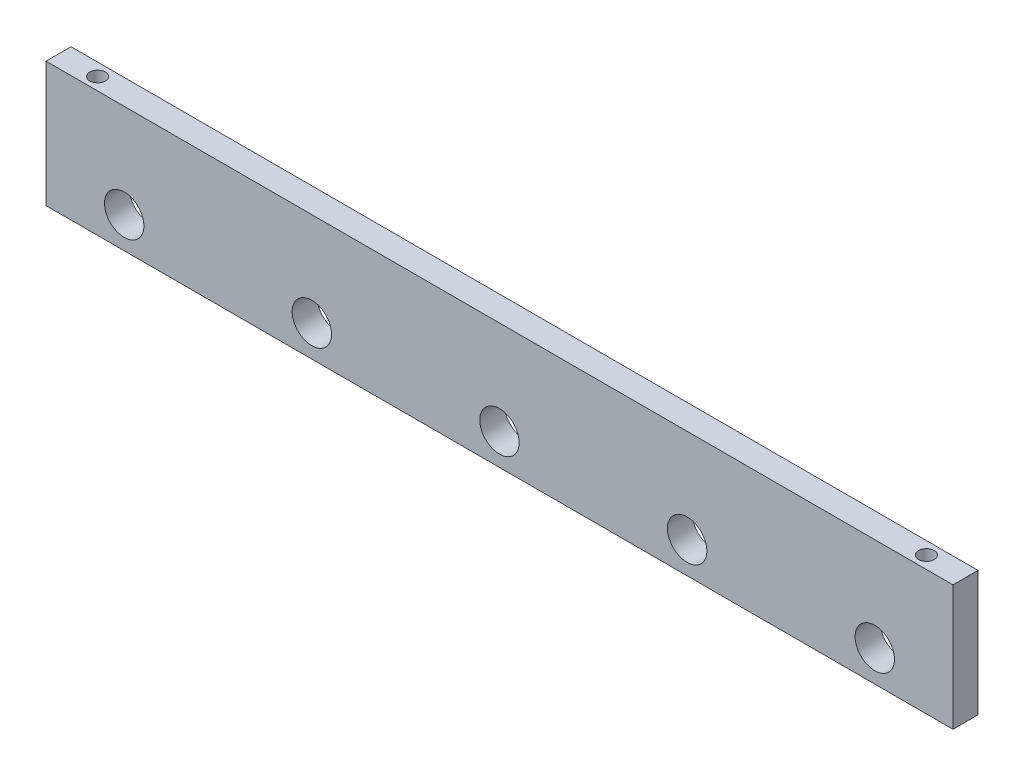
ISO-10303-21;
HEADER;
FILE_DESCRIPTION(('STEP AP214'),'2;1');
FILE_NAME('part.step','',(''),(''),'','','');
FILE_SCHEMA(('AUTOMOTIVE_DESIGN { 1 0 10303 214 1 1 1 1 }'));
ENDSEC;
DATA;
#1=APPLICATION_CONTEXT('core data for automotive mechanical design processes');
#2=APPLICATION_PROTOCOL_DEFINITION('international standard','automotive_design',2000,#1);
#3=PRODUCT_CONTEXT('',#1,'mechanical');
#4=PRODUCT('Part','Part','',(#3));
#5=PRODUCT_RELATED_PRODUCT_CATEGORY('part','',(#4));
#6=PRODUCT_DEFINITION_FORMATION('','',#4);
#7=PRODUCT_DEFINITION_CONTEXT('part definition',#1,'design');
#8=PRODUCT_DEFINITION('design','',#6,#7);
#9=PRODUCT_DEFINITION_SHAPE('','',#8);
#10=(LENGTH_UNIT() NAMED_UNIT(*) SI_UNIT(.MILLI.,.METRE.));
#11=(NAMED_UNIT(*) PLANE_ANGLE_UNIT() SI_UNIT($,.RADIAN.));
#12=(NAMED_UNIT(*) SI_UNIT($,.STERADIAN.) SOLID_ANGLE_UNIT());
#13=UNCERTAINTY_MEASURE_WITH_UNIT(LENGTH_MEASURE(1.E-05),#10,'distance_accuracy_value','');
#14=(GEOMETRIC_REPRESENTATION_CONTEXT(3) GLOBAL_UNCERTAINTY_ASSIGNED_CONTEXT((#13)) GLOBAL_UNIT_ASSIGNED_CONTEXT((#10,
#11,#12)) REPRESENTATION_CONTEXT('',''));
#15=CARTESIAN_POINT('',(0.,0.,0.));
#16=DIRECTION('',(0.,0.,1.));
#17=DIRECTION('',(1.,0.,0.));
#18=AXIS2_PLACEMENT_3D('',#15,#16,#17);
#19=CARTESIAN_POINT('',(0.,0.,8.));
#20=DIRECTION('',(0.,0.,-1.));
#21=DIRECTION('',(-1.,0.,0.));
#22=AXIS2_PLACEMENT_3D('',#19,#20,#21);
#23=PLANE('',#22);
#24=DIRECTION('',(0.,1.,0.));
#25=VECTOR('',#24,1.);
#26=CARTESIAN_POINT('',(290.,-40.,8.));
#27=LINE('',#26,#25);
#28=CARTESIAN_POINT('',(290.,-40.,8.));
#29=VERTEX_POINT('',#28);
#30=CARTESIAN_POINT('',(290.,40.,8.));
#31=VERTEX_POINT('',#30);
#32=EDGE_CURVE('E98',#29,#31,#27,.T.);
#33=ORIENTED_EDGE('',*,*,#32,.T.);
#34=DIRECTION('',(-1.,0.,0.));
#35=VECTOR('',#34,1.);
#36=CARTESIAN_POINT('',(-290.,40.,8.));
#37=LINE('',#36,#35);
#38=CARTESIAN_POINT('',(-290.,40.,8.));
#39=VERTEX_POINT('',#38);
#40=EDGE_CURVE('E93',#31,#39,#37,.T.);
#41=ORIENTED_EDGE('',*,*,#40,.T.);
#42=DIRECTION('',(0.,-1.,0.));
#43=VECTOR('',#42,1.);
#44=CARTESIAN_POINT('',(-290.,-40.,8.));
#45=LINE('',#44,#43);
#46=CARTESIAN_POINT('',(-290.,-40.,8.));
#47=VERTEX_POINT('',#46);
#48=EDGE_CURVE('E96',#39,#47,#45,.T.);
#49=ORIENTED_EDGE('',*,*,#48,.T.);
#50=DIRECTION('',(1.,0.,0.));
#51=VECTOR('',#50,1.);
#52=CARTESIAN_POINT('',(-290.,-40.,8.));
#53=LINE('',#52,#51);
#54=EDGE_CURVE('E63',#47,#29,#53,.T.);
#55=ORIENTED_EDGE('',*,*,#54,.T.);
#56=EDGE_LOOP('',(#33,#41,#49,#55));
#57=FACE_BOUND('',#56,.T.);
#58=CARTESIAN_POINT('',(-240.,-20.,8.));
#59=DIRECTION('',(0.,0.,1.));
#60=DIRECTION('',(1.,0.,0.));
#61=AXIS2_PLACEMENT_3D('',#58,#59,#60);
#62=CIRCLE('',#61,12.6);
#63=CARTESIAN_POINT('',(-227.4,-20.,8.));
#64=VERTEX_POINT('',#63);
#65=EDGE_CURVE('E118',#64,#64,#62,.T.);
#66=ORIENTED_EDGE('',*,*,#65,.F.);
#67=EDGE_LOOP('',(#66));
#68=FACE_BOUND('',#67,.T.);
#69=CARTESIAN_POINT('',(-120.,-20.,8.));
#70=DIRECTION('',(0.,0.,1.));
#71=DIRECTION('',(1.,0.,0.));
#72=AXIS2_PLACEMENT_3D('',#69,#70,#71);
#73=CIRCLE('',#72,12.6);
#74=CARTESIAN_POINT('',(-107.4,-20.,8.));
#75=VERTEX_POINT('',#74);
#76=EDGE_CURVE('E140',#75,#75,#73,.T.);
#77=ORIENTED_EDGE('',*,*,#76,.F.);
#78=EDGE_LOOP('',(#77));
#79=FACE_BOUND('',#78,.T.);
#80=CARTESIAN_POINT('',(0.,-20.,8.));
#81=DIRECTION('',(0.,0.,1.));
#82=DIRECTION('',(1.,0.,0.));
#83=AXIS2_PLACEMENT_3D('',#80,#81,#82);
#84=CIRCLE('',#83,12.6);
#85=CARTESIAN_POINT('',(12.6,-20.,8.));
#86=VERTEX_POINT('',#85);
#87=EDGE_CURVE('E148',#86,#86,#84,.T.);
#88=ORIENTED_EDGE('',*,*,#87,.F.);
#89=EDGE_LOOP('',(#88));
#90=FACE_BOUND('',#89,.T.);
#91=CARTESIAN_POINT('',(120.,-20.,8.));
#92=DIRECTION('',(0.,0.,1.));
#93=DIRECTION('',(1.,0.,0.));
#94=AXIS2_PLACEMENT_3D('',#91,#92,#93);
#95=CIRCLE('',#94,12.6);
#96=CARTESIAN_POINT('',(132.6,-20.,8.));
#97=VERTEX_POINT('',#96);
#98=EDGE_CURVE('E156',#97,#97,#95,.T.);
#99=ORIENTED_EDGE('',*,*,#98,.F.);
#100=EDGE_LOOP('',(#99));
#101=FACE_BOUND('',#100,.T.);
#102=CARTESIAN_POINT('',(240.,-20.,8.));
#103=DIRECTION('',(0.,0.,1.));
#104=DIRECTION('',(1.,0.,0.));
#105=AXIS2_PLACEMENT_3D('',#102,#103,#104);
#106=CIRCLE('',#105,12.6);
#107=CARTESIAN_POINT('',(252.6,-20.,8.));
#108=VERTEX_POINT('',#107);
#109=EDGE_CURVE('E164',#108,#108,#106,.T.);
#110=ORIENTED_EDGE('',*,*,#109,.F.);
#111=EDGE_LOOP('',(#110));
#112=FACE_BOUND('',#111,.T.);
#113=ADVANCED_FACE('F45',(#57,#68,#79,#90,#101,#112),#23,.F.);
#114=CARTESIAN_POINT('',(0.,0.,-8.));
#115=DIRECTION('',(0.,0.,-1.));
#116=DIRECTION('',(-1.,0.,0.));
#117=AXIS2_PLACEMENT_3D('',#114,#115,#116);
#118=PLANE('',#117);
#119=CARTESIAN_POINT('',(120.,-20.,-8.));
#120=DIRECTION('',(0.,0.,1.));
#121=DIRECTION('',(1.,0.,0.));
#122=AXIS2_PLACEMENT_3D('',#119,#120,#121);
#123=CIRCLE('',#122,12.6);
#124=CARTESIAN_POINT('',(132.6,-20.,-8.));
#125=VERTEX_POINT('',#124);
#126=EDGE_CURVE('E160',#125,#125,#123,.T.);
#127=ORIENTED_EDGE('',*,*,#126,.T.);
#128=EDGE_LOOP('',(#127));
#129=FACE_BOUND('',#128,.T.);
#130=CARTESIAN_POINT('',(-120.,-20.,-8.));
#131=DIRECTION('',(0.,0.,1.));
#132=DIRECTION('',(1.,0.,0.));
#133=AXIS2_PLACEMENT_3D('',#130,#131,#132);
#134=CIRCLE('',#133,12.6);
#135=CARTESIAN_POINT('',(-107.4,-20.,-8.));
#136=VERTEX_POINT('',#135);
#137=EDGE_CURVE('E144',#136,#136,#134,.T.);
#138=ORIENTED_EDGE('',*,*,#137,.T.);
#139=EDGE_LOOP('',(#138));
#140=FACE_BOUND('',#139,.T.);
#141=DIRECTION('',(0.,1.,0.));
#142=VECTOR('',#141,1.);
#143=CARTESIAN_POINT('',(290.,-40.,-8.));
#144=LINE('',#143,#142);
#145=CARTESIAN_POINT('',(290.,-40.,-8.));
#146=VERTEX_POINT('',#145);
#147=CARTESIAN_POINT('',(290.,40.,-8.));
#148=VERTEX_POINT('',#147);
#149=EDGE_CURVE('E114',#146,#148,#144,.T.);
#150=ORIENTED_EDGE('',*,*,#149,.F.);
#151=DIRECTION('',(1.,0.,0.));
#152=VECTOR('',#151,1.);
#153=CARTESIAN_POINT('',(-290.,-40.,-8.));
#154=LINE('',#153,#152);
#155=CARTESIAN_POINT('',(-290.,-40.,-8.));
#156=VERTEX_POINT('',#155);
#157=EDGE_CURVE('E86',#156,#146,#154,.T.);
#158=ORIENTED_EDGE('',*,*,#157,.F.);
#159=DIRECTION('',(0.,-1.,0.));
#160=VECTOR('',#159,1.);
#161=CARTESIAN_POINT('',(-290.,-40.,-8.));
#162=LINE('',#161,#160);
#163=CARTESIAN_POINT('',(-290.,40.,-8.));
#164=VERTEX_POINT('',#163);
#165=EDGE_CURVE('E80',#164,#156,#162,.T.);
#166=ORIENTED_EDGE('',*,*,#165,.F.);
#167=DIRECTION('',(-1.,0.,0.));
#168=VECTOR('',#167,1.);
#169=CARTESIAN_POINT('',(-290.,40.,-8.));
#170=LINE('',#169,#168);
#171=EDGE_CURVE('E103',#148,#164,#170,.T.);
#172=ORIENTED_EDGE('',*,*,#171,.F.);
#173=EDGE_LOOP('',(#150,#158,#166,#172));
#174=FACE_BOUND('',#173,.T.);
#175=CARTESIAN_POINT('',(-240.,-20.,-8.));
#176=DIRECTION('',(0.,0.,1.));
#177=DIRECTION('',(1.,0.,0.));
#178=AXIS2_PLACEMENT_3D('',#175,#176,#177);
#179=CIRCLE('',#178,12.6);
#180=CARTESIAN_POINT('',(-227.4,-20.,-8.));
#181=VERTEX_POINT('',#180);
#182=EDGE_CURVE('E136',#181,#181,#179,.T.);
#183=ORIENTED_EDGE('',*,*,#182,.T.);
#184=EDGE_LOOP('',(#183));
#185=FACE_BOUND('',#184,.T.);
#186=CARTESIAN_POINT('',(0.,-20.,-8.));
#187=DIRECTION('',(0.,0.,1.));
#188=DIRECTION('',(1.,0.,0.));
#189=AXIS2_PLACEMENT_3D('',#186,#187,#188);
#190=CIRCLE('',#189,12.6);
#191=CARTESIAN_POINT('',(12.6,-20.,-8.));
#192=VERTEX_POINT('',#191);
#193=EDGE_CURVE('E152',#192,#192,#190,.T.);
#194=ORIENTED_EDGE('',*,*,#193,.T.);
#195=EDGE_LOOP('',(#194));
#196=FACE_BOUND('',#195,.T.);
#197=CARTESIAN_POINT('',(240.,-20.,-8.));
#198=DIRECTION('',(0.,0.,1.));
#199=DIRECTION('',(1.,0.,0.));
#200=AXIS2_PLACEMENT_3D('',#197,#198,#199);
#201=CIRCLE('',#200,12.6);
#202=CARTESIAN_POINT('',(252.6,-20.,-8.));
#203=VERTEX_POINT('',#202);
#204=EDGE_CURVE('E168',#203,#203,#201,.T.);
#205=ORIENTED_EDGE('',*,*,#204,.T.);
#206=EDGE_LOOP('',(#205));
#207=FACE_BOUND('',#206,.T.);
#208=ADVANCED_FACE('F131',(#129,#140,#174,#185,#196,#207),#118,.T.);
#209=CARTESIAN_POINT('',(290.,-40.,8.));
#210=DIRECTION('',(-1.,0.,0.));
#211=DIRECTION('',(0.,0.,1.));
#212=AXIS2_PLACEMENT_3D('',#209,#210,#211);
#213=PLANE('',#212);
#214=ORIENTED_EDGE('',*,*,#149,.T.);
#215=DIRECTION('',(0.,0.,-1.));
#216=VECTOR('',#215,1.);
#217=CARTESIAN_POINT('',(290.,40.,8.));
#218=LINE('',#217,#216);
#219=EDGE_CURVE('E11',#31,#148,#218,.T.);
#220=ORIENTED_EDGE('',*,*,#219,.F.);
#221=ORIENTED_EDGE('',*,*,#32,.F.);
#222=DIRECTION('',(0.,0.,-1.));
#223=VECTOR('',#222,1.);
#224=CARTESIAN_POINT('',(290.,-40.,8.));
#225=LINE('',#224,#223);
#226=EDGE_CURVE('E110',#29,#146,#225,.T.);
#227=ORIENTED_EDGE('',*,*,#226,.T.);
#228=EDGE_LOOP('',(#214,#220,#221,#227));
#229=FACE_BOUND('',#228,.T.);
#230=ADVANCED_FACE('F47',(#229),#213,.F.);
#231=CARTESIAN_POINT('',(-290.,40.,8.));
#232=DIRECTION('',(0.,-1.,0.));
#233=DIRECTION('',(0.,0.,-1.));
#234=AXIS2_PLACEMENT_3D('',#231,#232,#233);
#235=PLANE('',#234);
#236=CARTESIAN_POINT('',(-265.,40.,0.));
#237=DIRECTION('',(0.,1.,0.));
#238=DIRECTION('',(0.,0.,1.));
#239=AXIS2_PLACEMENT_3D('',#236,#237,#238);
#240=CIRCLE('',#239,4.99999999999999);
#241=CARTESIAN_POINT('',(-265.,40.,4.99999999999999));
#242=VERTEX_POINT('',#241);
#243=EDGE_CURVE('E184',#242,#242,#240,.T.);
#244=ORIENTED_EDGE('',*,*,#243,.F.);
#245=EDGE_LOOP('',(#244));
#246=FACE_BOUND('',#245,.T.);
#247=CARTESIAN_POINT('',(265.,40.,0.));
#248=DIRECTION('',(0.,1.,0.));
#249=DIRECTION('',(0.,0.,1.));
#250=AXIS2_PLACEMENT_3D('',#247,#248,#249);
#251=CIRCLE('',#250,4.99999999999999);
#252=CARTESIAN_POINT('',(265.,40.,4.99999999999999));
#253=VERTEX_POINT('',#252);
#254=EDGE_CURVE('E180',#253,#253,#251,.T.);
#255=ORIENTED_EDGE('',*,*,#254,.F.);
#256=EDGE_LOOP('',(#255));
#257=FACE_BOUND('',#256,.T.);
#258=ORIENTED_EDGE('',*,*,#171,.T.);
#259=DIRECTION('',(0.,0.,-1.));
#260=VECTOR('',#259,1.);
#261=CARTESIAN_POINT('',(-290.,40.,8.));
#262=LINE('',#261,#260);
#263=EDGE_CURVE('E55',#39,#164,#262,.T.);
#264=ORIENTED_EDGE('',*,*,#263,.F.);
#265=ORIENTED_EDGE('',*,*,#40,.F.);
#266=ORIENTED_EDGE('',*,*,#219,.T.);
#267=EDGE_LOOP('',(#258,#264,#265,#266));
#268=FACE_BOUND('',#267,.T.);
#269=ADVANCED_FACE('F102',(#246,#257,#268),#235,.F.);
#270=CARTESIAN_POINT('',(-290.,-40.,8.));
#271=DIRECTION('',(1.,0.,0.));
#272=DIRECTION('',(0.,0.,-1.));
#273=AXIS2_PLACEMENT_3D('',#270,#271,#272);
#274=PLANE('',#273);
#275=ORIENTED_EDGE('',*,*,#165,.T.);
#276=DIRECTION('',(0.,0.,-1.));
#277=VECTOR('',#276,1.);
#278=CARTESIAN_POINT('',(-290.,-40.,8.));
#279=LINE('',#278,#277);
#280=EDGE_CURVE('E105',#47,#156,#279,.T.);
#281=ORIENTED_EDGE('',*,*,#280,.F.);
#282=ORIENTED_EDGE('',*,*,#48,.F.);
#283=ORIENTED_EDGE('',*,*,#263,.T.);
#284=EDGE_LOOP('',(#275,#281,#282,#283));
#285=FACE_BOUND('',#284,.T.);
#286=ADVANCED_FACE('F106',(#285),#274,.F.);
#287=CARTESIAN_POINT('',(-290.,-40.,8.));
#288=DIRECTION('',(0.,1.,0.));
#289=DIRECTION('',(0.,0.,1.));
#290=AXIS2_PLACEMENT_3D('',#287,#288,#289);
#291=PLANE('',#290);
#292=CARTESIAN_POINT('',(-265.,-40.,0.));
#293=DIRECTION('',(0.,1.,0.));
#294=DIRECTION('',(0.,0.,1.));
#295=AXIS2_PLACEMENT_3D('',#292,#293,#294);
#296=CIRCLE('',#295,4.99999999999999);
#297=CARTESIAN_POINT('',(-265.,-40.,4.99999999999999));
#298=VERTEX_POINT('',#297);
#299=EDGE_CURVE('E172',#298,#298,#296,.T.);
#300=ORIENTED_EDGE('',*,*,#299,.T.);
#301=EDGE_LOOP('',(#300));
#302=FACE_BOUND('',#301,.T.);
#303=CARTESIAN_POINT('',(265.,-40.,0.));
#304=DIRECTION('',(0.,1.,0.));
#305=DIRECTION('',(0.,0.,1.));
#306=AXIS2_PLACEMENT_3D('',#303,#304,#305);
#307=CIRCLE('',#306,4.99999999999999);
#308=CARTESIAN_POINT('',(265.,-40.,4.99999999999999));
#309=VERTEX_POINT('',#308);
#310=EDGE_CURVE('E176',#309,#309,#307,.T.);
#311=ORIENTED_EDGE('',*,*,#310,.T.);
#312=EDGE_LOOP('',(#311));
#313=FACE_BOUND('',#312,.T.);
#314=ORIENTED_EDGE('',*,*,#157,.T.);
#315=ORIENTED_EDGE('',*,*,#226,.F.);
#316=ORIENTED_EDGE('',*,*,#54,.F.);
#317=ORIENTED_EDGE('',*,*,#280,.T.);
#318=EDGE_LOOP('',(#314,#315,#316,#317));
#319=FACE_BOUND('',#318,.T.);
#320=ADVANCED_FACE('F128',(#302,#313,#319),#291,.F.);
#321=CARTESIAN_POINT('',(-240.,-20.,8.));
#322=DIRECTION('',(0.,0.,-1.));
#323=DIRECTION('',(-1.,0.,0.));
#324=AXIS2_PLACEMENT_3D('',#321,#322,#323);
#325=CYLINDRICAL_SURFACE('',#324,12.6);
#326=ORIENTED_EDGE('',*,*,#65,.T.);
#327=EDGE_LOOP('',(#326));
#328=FACE_BOUND('',#327,.T.);
#329=ORIENTED_EDGE('',*,*,#182,.F.);
#330=EDGE_LOOP('',(#329));
#331=FACE_BOUND('',#330,.T.);
#332=ADVANCED_FACE('F225',(#328,#331),#325,.F.);
#333=CARTESIAN_POINT('',(-120.,-20.,8.));
#334=DIRECTION('',(0.,0.,-1.));
#335=DIRECTION('',(-1.,0.,0.));
#336=AXIS2_PLACEMENT_3D('',#333,#334,#335);
#337=CYLINDRICAL_SURFACE('',#336,12.6);
#338=ORIENTED_EDGE('',*,*,#76,.T.);
#339=EDGE_LOOP('',(#338));
#340=FACE_BOUND('',#339,.T.);
#341=ORIENTED_EDGE('',*,*,#137,.F.);
#342=EDGE_LOOP('',(#341));
#343=FACE_BOUND('',#342,.T.);
#344=ADVANCED_FACE('F244',(#340,#343),#337,.F.);
#345=CARTESIAN_POINT('',(0.,-20.,8.));
#346=DIRECTION('',(0.,0.,-1.));
#347=DIRECTION('',(-1.,0.,0.));
#348=AXIS2_PLACEMENT_3D('',#345,#346,#347);
#349=CYLINDRICAL_SURFACE('',#348,12.6);
#350=ORIENTED_EDGE('',*,*,#87,.T.);
#351=EDGE_LOOP('',(#350));
#352=FACE_BOUND('',#351,.T.);
#353=ORIENTED_EDGE('',*,*,#193,.F.);
#354=EDGE_LOOP('',(#353));
#355=FACE_BOUND('',#354,.T.);
#356=ADVANCED_FACE('F252',(#352,#355),#349,.F.);
#357=CARTESIAN_POINT('',(120.,-20.,8.));
#358=DIRECTION('',(0.,0.,-1.));
#359=DIRECTION('',(-1.,0.,0.));
#360=AXIS2_PLACEMENT_3D('',#357,#358,#359);
#361=CYLINDRICAL_SURFACE('',#360,12.6);
#362=ORIENTED_EDGE('',*,*,#98,.T.);
#363=EDGE_LOOP('',(#362));
#364=FACE_BOUND('',#363,.T.);
#365=ORIENTED_EDGE('',*,*,#126,.F.);
#366=EDGE_LOOP('',(#365));
#367=FACE_BOUND('',#366,.T.);
#368=ADVANCED_FACE('F213',(#364,#367),#361,.F.);
#369=CARTESIAN_POINT('',(240.,-20.,8.));
#370=DIRECTION('',(0.,0.,-1.));
#371=DIRECTION('',(-1.,0.,0.));
#372=AXIS2_PLACEMENT_3D('',#369,#370,#371);
#373=CYLINDRICAL_SURFACE('',#372,12.6);
#374=ORIENTED_EDGE('',*,*,#109,.T.);
#375=EDGE_LOOP('',(#374));
#376=FACE_BOUND('',#375,.T.);
#377=ORIENTED_EDGE('',*,*,#204,.F.);
#378=EDGE_LOOP('',(#377));
#379=FACE_BOUND('',#378,.T.);
#380=ADVANCED_FACE('F206',(#376,#379),#373,.F.);
#381=CARTESIAN_POINT('',(265.,-40.,0.));
#382=DIRECTION('',(0.,1.,0.));
#383=DIRECTION('',(0.,0.,1.));
#384=AXIS2_PLACEMENT_3D('',#381,#382,#383);
#385=CYLINDRICAL_SURFACE('',#384,4.99999999999999);
#386=ORIENTED_EDGE('',*,*,#310,.F.);
#387=EDGE_LOOP('',(#386));
#388=FACE_BOUND('',#387,.T.);
#389=ORIENTED_EDGE('',*,*,#254,.T.);
#390=EDGE_LOOP('',(#389));
#391=FACE_BOUND('',#390,.T.);
#392=ADVANCED_FACE('F197',(#388,#391),#385,.F.);
#393=CARTESIAN_POINT('',(-265.,-40.,0.));
#394=DIRECTION('',(0.,1.,0.));
#395=DIRECTION('',(0.,0.,1.));
#396=AXIS2_PLACEMENT_3D('',#393,#394,#395);
#397=CYLINDRICAL_SURFACE('',#396,4.99999999999999);
#398=ORIENTED_EDGE('',*,*,#299,.F.);
#399=EDGE_LOOP('',(#398));
#400=FACE_BOUND('',#399,.T.);
#401=ORIENTED_EDGE('',*,*,#243,.T.);
#402=EDGE_LOOP('',(#401));
#403=FACE_BOUND('',#402,.T.);
#404=ADVANCED_FACE('F194',(#400,#403),#397,.F.);
#405=CLOSED_SHELL('',(#113,#208,#230,#269,#286,#320,#332,#344,#356,#368,#380,#392,#404));
#406=MANIFOLD_SOLID_BREP('B2',#405);
#407=ADVANCED_BREP_SHAPE_REPRESENTATION('',(#18,#406),#14);
#408=SHAPE_DEFINITION_REPRESENTATION(#9,#407);
ENDSEC;
END-ISO-10303-21;
